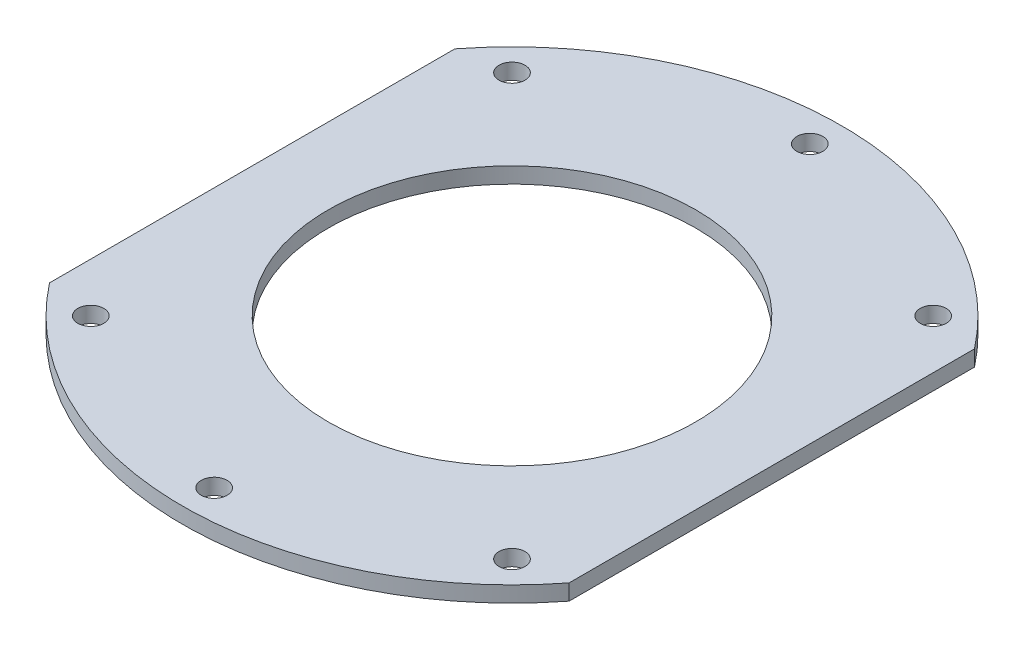
ISO-10303-21;
HEADER;
FILE_DESCRIPTION(('STEP AP214'),'2;1');
FILE_NAME('part.step','',(''),(''),'','','');
FILE_SCHEMA(('AUTOMOTIVE_DESIGN { 1 0 10303 214 1 1 1 1 }'));
ENDSEC;
DATA;
#1=APPLICATION_CONTEXT('core data for automotive mechanical design processes');
#2=APPLICATION_PROTOCOL_DEFINITION('international standard','automotive_design',2000,#1);
#3=PRODUCT_CONTEXT('',#1,'mechanical');
#4=PRODUCT('Part','Part','',(#3));
#5=PRODUCT_RELATED_PRODUCT_CATEGORY('part','',(#4));
#6=PRODUCT_DEFINITION_FORMATION('','',#4);
#7=PRODUCT_DEFINITION_CONTEXT('part definition',#1,'design');
#8=PRODUCT_DEFINITION('design','',#6,#7);
#9=PRODUCT_DEFINITION_SHAPE('','',#8);
#10=(LENGTH_UNIT() NAMED_UNIT(*) SI_UNIT(.MILLI.,.METRE.));
#11=(NAMED_UNIT(*) PLANE_ANGLE_UNIT() SI_UNIT($,.RADIAN.));
#12=(NAMED_UNIT(*) SI_UNIT($,.STERADIAN.) SOLID_ANGLE_UNIT());
#13=UNCERTAINTY_MEASURE_WITH_UNIT(LENGTH_MEASURE(1.E-05),#10,'distance_accuracy_value','');
#14=(GEOMETRIC_REPRESENTATION_CONTEXT(3) GLOBAL_UNCERTAINTY_ASSIGNED_CONTEXT((#13)) GLOBAL_UNIT_ASSIGNED_CONTEXT((#10,
#11,#12)) REPRESENTATION_CONTEXT('',''));
#15=CARTESIAN_POINT('',(0.,0.,0.));
#16=DIRECTION('',(0.,0.,1.));
#17=DIRECTION('',(1.,0.,0.));
#18=AXIS2_PLACEMENT_3D('',#15,#16,#17);
#19=CARTESIAN_POINT('',(0.,2.5,0.));
#20=DIRECTION('',(0.,1.,0.));
#21=DIRECTION('',(0.,0.,1.));
#22=AXIS2_PLACEMENT_3D('',#19,#20,#21);
#23=PLANE('',#22);
#24=CARTESIAN_POINT('',(0.,2.5,-47.));
#25=DIRECTION('',(0.,1.,0.));
#26=DIRECTION('',(0.,0.,1.));
#27=AXIS2_PLACEMENT_3D('',#24,#25,#26);
#28=CIRCLE('',#27,2.05);
#29=CARTESIAN_POINT('',(0.,2.5,-44.95));
#30=VERTEX_POINT('',#29);
#31=EDGE_CURVE('E268',#30,#30,#28,.T.);
#32=ORIENTED_EDGE('',*,*,#31,.F.);
#33=EDGE_LOOP('',(#32));
#34=FACE_BOUND('',#33,.T.);
#35=CARTESIAN_POINT('',(0.,2.5,47.));
#36=DIRECTION('',(0.,1.,0.));
#37=DIRECTION('',(0.,0.,1.));
#38=AXIS2_PLACEMENT_3D('',#35,#36,#37);
#39=CIRCLE('',#38,2.05);
#40=CARTESIAN_POINT('',(0.,2.5,49.05));
#41=VERTEX_POINT('',#40);
#42=EDGE_CURVE('E286',#41,#41,#39,.T.);
#43=ORIENTED_EDGE('',*,*,#42,.F.);
#44=EDGE_LOOP('',(#43));
#45=FACE_BOUND('',#44,.T.);
#46=CARTESIAN_POINT('',(0.,2.5,0.));
#47=DIRECTION('',(0.,1.,0.));
#48=DIRECTION('',(0.,0.,1.));
#49=AXIS2_PLACEMENT_3D('',#46,#47,#48);
#50=CIRCLE('',#49,29.);
#51=CARTESIAN_POINT('',(0.,2.5,29.));
#52=VERTEX_POINT('',#51);
#53=EDGE_CURVE('E125',#52,#52,#50,.T.);
#54=ORIENTED_EDGE('',*,*,#53,.F.);
#55=EDGE_LOOP('',(#54));
#56=FACE_BOUND('',#55,.T.);
#57=CARTESIAN_POINT('',(33.2340187157677,2.5,33.2340187157677));
#58=DIRECTION('',(0.,1.,0.));
#59=DIRECTION('',(0.,0.,1.));
#60=AXIS2_PLACEMENT_3D('',#57,#58,#59);
#61=CIRCLE('',#60,2.05);
#62=CARTESIAN_POINT('',(33.2340187157677,2.5,35.2840187157677));
#63=VERTEX_POINT('',#62);
#64=EDGE_CURVE('E292',#63,#63,#61,.T.);
#65=ORIENTED_EDGE('',*,*,#64,.F.);
#66=EDGE_LOOP('',(#65));
#67=FACE_BOUND('',#66,.T.);
#68=CARTESIAN_POINT('',(-33.2340187157677,2.5,33.2340187157677));
#69=DIRECTION('',(0.,1.,0.));
#70=DIRECTION('',(0.,0.,1.));
#71=AXIS2_PLACEMENT_3D('',#68,#69,#70);
#72=CIRCLE('',#71,2.05);
#73=CARTESIAN_POINT('',(-33.2340187157677,2.5,35.2840187157677));
#74=VERTEX_POINT('',#73);
#75=EDGE_CURVE('E280',#74,#74,#72,.T.);
#76=ORIENTED_EDGE('',*,*,#75,.F.);
#77=EDGE_LOOP('',(#76));
#78=FACE_BOUND('',#77,.T.);
#79=CARTESIAN_POINT('',(-33.2340187157677,2.5,-33.2340187157677));
#80=DIRECTION('',(0.,1.,0.));
#81=DIRECTION('',(0.,0.,1.));
#82=AXIS2_PLACEMENT_3D('',#79,#80,#81);
#83=CIRCLE('',#82,2.05);
#84=CARTESIAN_POINT('',(-33.2340187157677,2.5,-31.1840187157677));
#85=VERTEX_POINT('',#84);
#86=EDGE_CURVE('E274',#85,#85,#83,.T.);
#87=ORIENTED_EDGE('',*,*,#86,.F.);
#88=EDGE_LOOP('',(#87));
#89=FACE_BOUND('',#88,.T.);
#90=CARTESIAN_POINT('',(33.2340187157677,2.5,-33.2340187157677));
#91=DIRECTION('',(0.,1.,0.));
#92=DIRECTION('',(0.,0.,1.));
#93=AXIS2_PLACEMENT_3D('',#90,#91,#92);
#94=CIRCLE('',#93,2.05);
#95=CARTESIAN_POINT('',(33.2340187157677,2.5,-31.1840187157677));
#96=VERTEX_POINT('',#95);
#97=EDGE_CURVE('E258',#96,#96,#94,.T.);
#98=ORIENTED_EDGE('',*,*,#97,.F.);
#99=EDGE_LOOP('',(#98));
#100=FACE_BOUND('',#99,.T.);
#101=CARTESIAN_POINT('',(0.,2.5,0.));
#102=DIRECTION('',(0.,1.,0.));
#103=DIRECTION('',(0.,0.,1.));
#104=AXIS2_PLACEMENT_3D('',#101,#102,#103);
#105=CIRCLE('',#104,52.);
#106=CARTESIAN_POINT('',(-41.,2.5,31.984371183439));
#107=VERTEX_POINT('',#106);
#108=CARTESIAN_POINT('',(41.,2.5,31.984371183439));
#109=VERTEX_POINT('',#108);
#110=EDGE_CURVE('E111',#107,#109,#105,.T.);
#111=ORIENTED_EDGE('',*,*,#110,.T.);
#112=DIRECTION('',(0.,0.,-1.));
#113=VECTOR('',#112,1.);
#114=CARTESIAN_POINT('',(41.,2.5,55.0176136765046));
#115=LINE('',#114,#113);
#116=CARTESIAN_POINT('',(41.,2.5,-31.984371183439));
#117=VERTEX_POINT('',#116);
#118=EDGE_CURVE('E99',#109,#117,#115,.T.);
#119=ORIENTED_EDGE('',*,*,#118,.T.);
#120=CARTESIAN_POINT('',(-41.,2.5,-31.984371183439));
#121=VERTEX_POINT('',#120);
#122=EDGE_CURVE('E115',#117,#121,#105,.T.);
#123=ORIENTED_EDGE('',*,*,#122,.T.);
#124=DIRECTION('',(0.,0.,1.));
#125=VECTOR('',#124,1.);
#126=CARTESIAN_POINT('',(-41.,2.5,55.0176136765046));
#127=LINE('',#126,#125);
#128=EDGE_CURVE('E106',#121,#107,#127,.T.);
#129=ORIENTED_EDGE('',*,*,#128,.T.);
#130=EDGE_LOOP('',(#111,#119,#123,#129));
#131=FACE_BOUND('',#130,.T.);
#132=ADVANCED_FACE('F61',(#34,#45,#56,#67,#78,#89,#100,#131),#23,.T.);
#133=CARTESIAN_POINT('',(0.,0.,0.));
#134=DIRECTION('',(0.,1.,0.));
#135=DIRECTION('',(0.,0.,1.));
#136=AXIS2_PLACEMENT_3D('',#133,#134,#135);
#137=PLANE('',#136);
#138=CARTESIAN_POINT('',(0.,0.,0.));
#139=DIRECTION('',(0.,1.,0.));
#140=DIRECTION('',(0.,0.,1.));
#141=AXIS2_PLACEMENT_3D('',#138,#139,#140);
#142=CIRCLE('',#141,29.);
#143=CARTESIAN_POINT('',(0.,0.,29.));
#144=VERTEX_POINT('',#143);
#145=EDGE_CURVE('E122',#144,#144,#142,.T.);
#146=ORIENTED_EDGE('',*,*,#145,.T.);
#147=EDGE_LOOP('',(#146));
#148=FACE_BOUND('',#147,.T.);
#149=CARTESIAN_POINT('',(33.2340187157677,0.,33.2340187157677));
#150=DIRECTION('',(0.,1.,0.));
#151=DIRECTION('',(0.,0.,1.));
#152=AXIS2_PLACEMENT_3D('',#149,#150,#151);
#153=CIRCLE('',#152,2.05);
#154=CARTESIAN_POINT('',(33.2340187157677,0.,35.2840187157677));
#155=VERTEX_POINT('',#154);
#156=EDGE_CURVE('E289',#155,#155,#153,.T.);
#157=ORIENTED_EDGE('',*,*,#156,.T.);
#158=EDGE_LOOP('',(#157));
#159=FACE_BOUND('',#158,.T.);
#160=CARTESIAN_POINT('',(0.,0.,47.));
#161=DIRECTION('',(0.,1.,0.));
#162=DIRECTION('',(0.,0.,1.));
#163=AXIS2_PLACEMENT_3D('',#160,#161,#162);
#164=CIRCLE('',#163,2.05);
#165=CARTESIAN_POINT('',(0.,0.,49.05));
#166=VERTEX_POINT('',#165);
#167=EDGE_CURVE('E283',#166,#166,#164,.T.);
#168=ORIENTED_EDGE('',*,*,#167,.T.);
#169=EDGE_LOOP('',(#168));
#170=FACE_BOUND('',#169,.T.);
#171=CARTESIAN_POINT('',(-33.2340187157677,0.,33.2340187157677));
#172=DIRECTION('',(0.,1.,0.));
#173=DIRECTION('',(0.,0.,1.));
#174=AXIS2_PLACEMENT_3D('',#171,#172,#173);
#175=CIRCLE('',#174,2.05);
#176=CARTESIAN_POINT('',(-33.2340187157677,0.,35.2840187157677));
#177=VERTEX_POINT('',#176);
#178=EDGE_CURVE('E277',#177,#177,#175,.T.);
#179=ORIENTED_EDGE('',*,*,#178,.T.);
#180=EDGE_LOOP('',(#179));
#181=FACE_BOUND('',#180,.T.);
#182=CARTESIAN_POINT('',(-33.2340187157677,0.,-33.2340187157677));
#183=DIRECTION('',(0.,1.,0.));
#184=DIRECTION('',(0.,0.,1.));
#185=AXIS2_PLACEMENT_3D('',#182,#183,#184);
#186=CIRCLE('',#185,2.05);
#187=CARTESIAN_POINT('',(-33.2340187157677,0.,-31.1840187157677));
#188=VERTEX_POINT('',#187);
#189=EDGE_CURVE('E271',#188,#188,#186,.T.);
#190=ORIENTED_EDGE('',*,*,#189,.T.);
#191=EDGE_LOOP('',(#190));
#192=FACE_BOUND('',#191,.T.);
#193=CARTESIAN_POINT('',(0.,0.,-47.));
#194=DIRECTION('',(0.,1.,0.));
#195=DIRECTION('',(0.,0.,1.));
#196=AXIS2_PLACEMENT_3D('',#193,#194,#195);
#197=CIRCLE('',#196,2.05);
#198=CARTESIAN_POINT('',(0.,0.,-44.95));
#199=VERTEX_POINT('',#198);
#200=EDGE_CURVE('E264',#199,#199,#197,.T.);
#201=ORIENTED_EDGE('',*,*,#200,.T.);
#202=EDGE_LOOP('',(#201));
#203=FACE_BOUND('',#202,.T.);
#204=CARTESIAN_POINT('',(33.2340187157677,0.,-33.2340187157677));
#205=DIRECTION('',(0.,1.,0.));
#206=DIRECTION('',(0.,0.,1.));
#207=AXIS2_PLACEMENT_3D('',#204,#205,#206);
#208=CIRCLE('',#207,2.05);
#209=CARTESIAN_POINT('',(33.2340187157677,0.,-31.1840187157677));
#210=VERTEX_POINT('',#209);
#211=EDGE_CURVE('E261',#210,#210,#208,.T.);
#212=ORIENTED_EDGE('',*,*,#211,.T.);
#213=EDGE_LOOP('',(#212));
#214=FACE_BOUND('',#213,.T.);
#215=DIRECTION('',(0.,0.,-1.));
#216=VECTOR('',#215,1.);
#217=CARTESIAN_POINT('',(41.,0.,0.));
#218=LINE('',#217,#216);
#219=CARTESIAN_POINT('',(41.,0.,31.984371183439));
#220=VERTEX_POINT('',#219);
#221=CARTESIAN_POINT('',(41.,0.,-31.984371183439));
#222=VERTEX_POINT('',#221);
#223=EDGE_CURVE('E83',#220,#222,#218,.T.);
#224=ORIENTED_EDGE('',*,*,#223,.F.);
#225=CARTESIAN_POINT('',(0.,0.,0.));
#226=DIRECTION('',(0.,1.,0.));
#227=DIRECTION('',(0.,0.,1.));
#228=AXIS2_PLACEMENT_3D('',#225,#226,#227);
#229=CIRCLE('',#228,52.);
#230=CARTESIAN_POINT('',(-41.,0.,31.984371183439));
#231=VERTEX_POINT('',#230);
#232=EDGE_CURVE('E113',#231,#220,#229,.T.);
#233=ORIENTED_EDGE('',*,*,#232,.F.);
#234=DIRECTION('',(0.,0.,1.));
#235=VECTOR('',#234,1.);
#236=CARTESIAN_POINT('',(-41.,0.,0.));
#237=LINE('',#236,#235);
#238=CARTESIAN_POINT('',(-41.,0.,-31.984371183439));
#239=VERTEX_POINT('',#238);
#240=EDGE_CURVE('E76',#239,#231,#237,.T.);
#241=ORIENTED_EDGE('',*,*,#240,.F.);
#242=EDGE_CURVE('E116',#222,#239,#229,.T.);
#243=ORIENTED_EDGE('',*,*,#242,.F.);
#244=EDGE_LOOP('',(#224,#233,#241,#243));
#245=FACE_BOUND('',#244,.T.);
#246=ADVANCED_FACE('F133',(#148,#159,#170,#181,#192,#203,#214,#245),#137,.F.);
#247=CARTESIAN_POINT('',(0.,2.5,0.));
#248=DIRECTION('',(0.,-1.,0.));
#249=DIRECTION('',(0.,0.,-1.));
#250=AXIS2_PLACEMENT_3D('',#247,#248,#249);
#251=CYLINDRICAL_SURFACE('',#250,52.);
#252=DIRECTION('',(0.,-1.,0.));
#253=VECTOR('',#252,1.);
#254=CARTESIAN_POINT('',(41.,2.5,31.984371183439));
#255=LINE('',#254,#253);
#256=EDGE_CURVE('E12',#109,#220,#255,.T.);
#257=ORIENTED_EDGE('',*,*,#256,.F.);
#258=ORIENTED_EDGE('',*,*,#110,.F.);
#259=DIRECTION('',(0.,-1.,0.));
#260=VECTOR('',#259,1.);
#261=CARTESIAN_POINT('',(-41.,2.5,31.984371183439));
#262=LINE('',#261,#260);
#263=EDGE_CURVE('E118',#231,#107,#262,.F.);
#264=ORIENTED_EDGE('',*,*,#263,.F.);
#265=ORIENTED_EDGE('',*,*,#232,.T.);
#266=EDGE_LOOP('',(#257,#258,#264,#265));
#267=FACE_BOUND('',#266,.T.);
#268=ADVANCED_FACE('F63',(#267),#251,.T.);
#269=DIRECTION('',(0.,-1.,0.));
#270=VECTOR('',#269,1.);
#271=CARTESIAN_POINT('',(41.,2.5,-31.984371183439));
#272=LINE('',#271,#270);
#273=EDGE_CURVE('E69',#222,#117,#272,.F.);
#274=ORIENTED_EDGE('',*,*,#273,.F.);
#275=ORIENTED_EDGE('',*,*,#242,.T.);
#276=DIRECTION('',(0.,-1.,0.));
#277=VECTOR('',#276,1.);
#278=CARTESIAN_POINT('',(-41.,2.5,-31.984371183439));
#279=LINE('',#278,#277);
#280=EDGE_CURVE('E127',#121,#239,#279,.T.);
#281=ORIENTED_EDGE('',*,*,#280,.F.);
#282=ORIENTED_EDGE('',*,*,#122,.F.);
#283=EDGE_LOOP('',(#274,#275,#281,#282));
#284=FACE_BOUND('',#283,.T.);
#285=ADVANCED_FACE('F135',(#284),#251,.T.);
#286=CARTESIAN_POINT('',(0.,2.5,0.));
#287=DIRECTION('',(0.,-1.,0.));
#288=DIRECTION('',(0.,0.,-1.));
#289=AXIS2_PLACEMENT_3D('',#286,#287,#288);
#290=CYLINDRICAL_SURFACE('',#289,29.);
#291=ORIENTED_EDGE('',*,*,#53,.T.);
#292=EDGE_LOOP('',(#291));
#293=FACE_BOUND('',#292,.T.);
#294=ORIENTED_EDGE('',*,*,#145,.F.);
#295=EDGE_LOOP('',(#294));
#296=FACE_BOUND('',#295,.T.);
#297=ADVANCED_FACE('F137',(#293,#296),#290,.F.);
#298=CARTESIAN_POINT('',(33.2340187157677,2.5,33.2340187157677));
#299=DIRECTION('',(0.,-1.,0.));
#300=DIRECTION('',(0.,0.,-1.));
#301=AXIS2_PLACEMENT_3D('',#298,#299,#300);
#302=CYLINDRICAL_SURFACE('',#301,2.05);
#303=ORIENTED_EDGE('',*,*,#64,.T.);
#304=EDGE_LOOP('',(#303));
#305=FACE_BOUND('',#304,.T.);
#306=ORIENTED_EDGE('',*,*,#156,.F.);
#307=EDGE_LOOP('',(#306));
#308=FACE_BOUND('',#307,.T.);
#309=ADVANCED_FACE('F142',(#305,#308),#302,.F.);
#310=CARTESIAN_POINT('',(0.,2.5,47.));
#311=DIRECTION('',(0.,-1.,0.));
#312=DIRECTION('',(0.,0.,-1.));
#313=AXIS2_PLACEMENT_3D('',#310,#311,#312);
#314=CYLINDRICAL_SURFACE('',#313,2.05);
#315=ORIENTED_EDGE('',*,*,#42,.T.);
#316=EDGE_LOOP('',(#315));
#317=FACE_BOUND('',#316,.T.);
#318=ORIENTED_EDGE('',*,*,#167,.F.);
#319=EDGE_LOOP('',(#318));
#320=FACE_BOUND('',#319,.T.);
#321=ADVANCED_FACE('F157',(#317,#320),#314,.F.);
#322=CARTESIAN_POINT('',(-33.2340187157677,2.5,33.2340187157677));
#323=DIRECTION('',(0.,-1.,0.));
#324=DIRECTION('',(0.,0.,-1.));
#325=AXIS2_PLACEMENT_3D('',#322,#323,#324);
#326=CYLINDRICAL_SURFACE('',#325,2.05);
#327=ORIENTED_EDGE('',*,*,#75,.T.);
#328=EDGE_LOOP('',(#327));
#329=FACE_BOUND('',#328,.T.);
#330=ORIENTED_EDGE('',*,*,#178,.F.);
#331=EDGE_LOOP('',(#330));
#332=FACE_BOUND('',#331,.T.);
#333=ADVANCED_FACE('F161',(#329,#332),#326,.F.);
#334=CARTESIAN_POINT('',(-33.2340187157677,2.5,-33.2340187157677));
#335=DIRECTION('',(0.,-1.,0.));
#336=DIRECTION('',(0.,0.,-1.));
#337=AXIS2_PLACEMENT_3D('',#334,#335,#336);
#338=CYLINDRICAL_SURFACE('',#337,2.05);
#339=ORIENTED_EDGE('',*,*,#86,.T.);
#340=EDGE_LOOP('',(#339));
#341=FACE_BOUND('',#340,.T.);
#342=ORIENTED_EDGE('',*,*,#189,.F.);
#343=EDGE_LOOP('',(#342));
#344=FACE_BOUND('',#343,.T.);
#345=ADVANCED_FACE('F165',(#341,#344),#338,.F.);
#346=CARTESIAN_POINT('',(0.,2.5,-47.));
#347=DIRECTION('',(0.,-1.,0.));
#348=DIRECTION('',(0.,0.,-1.));
#349=AXIS2_PLACEMENT_3D('',#346,#347,#348);
#350=CYLINDRICAL_SURFACE('',#349,2.05);
#351=ORIENTED_EDGE('',*,*,#31,.T.);
#352=EDGE_LOOP('',(#351));
#353=FACE_BOUND('',#352,.T.);
#354=ORIENTED_EDGE('',*,*,#200,.F.);
#355=EDGE_LOOP('',(#354));
#356=FACE_BOUND('',#355,.T.);
#357=ADVANCED_FACE('F169',(#353,#356),#350,.F.);
#358=CARTESIAN_POINT('',(33.2340187157677,2.5,-33.2340187157677));
#359=DIRECTION('',(0.,-1.,0.));
#360=DIRECTION('',(0.,0.,-1.));
#361=AXIS2_PLACEMENT_3D('',#358,#359,#360);
#362=CYLINDRICAL_SURFACE('',#361,2.05);
#363=ORIENTED_EDGE('',*,*,#97,.T.);
#364=EDGE_LOOP('',(#363));
#365=FACE_BOUND('',#364,.T.);
#366=ORIENTED_EDGE('',*,*,#211,.F.);
#367=EDGE_LOOP('',(#366));
#368=FACE_BOUND('',#367,.T.);
#369=ADVANCED_FACE('F173',(#365,#368),#362,.F.);
#370=CARTESIAN_POINT('',(-41.,-1.5,55.0176136765046));
#371=DIRECTION('',(-1.,0.,0.));
#372=DIRECTION('',(0.,0.,1.));
#373=AXIS2_PLACEMENT_3D('',#370,#371,#372);
#374=PLANE('',#373);
#375=ORIENTED_EDGE('',*,*,#280,.T.);
#376=ORIENTED_EDGE('',*,*,#240,.T.);
#377=ORIENTED_EDGE('',*,*,#263,.T.);
#378=ORIENTED_EDGE('',*,*,#128,.F.);
#379=EDGE_LOOP('',(#375,#376,#377,#378));
#380=FACE_BOUND('',#379,.T.);
#381=ADVANCED_FACE('F129',(#380),#374,.T.);
#382=CARTESIAN_POINT('',(41.,-1.5,55.0176136765046));
#383=DIRECTION('',(1.,0.,0.));
#384=DIRECTION('',(0.,0.,-1.));
#385=AXIS2_PLACEMENT_3D('',#382,#383,#384);
#386=PLANE('',#385);
#387=ORIENTED_EDGE('',*,*,#256,.T.);
#388=ORIENTED_EDGE('',*,*,#223,.T.);
#389=ORIENTED_EDGE('',*,*,#273,.T.);
#390=ORIENTED_EDGE('',*,*,#118,.F.);
#391=EDGE_LOOP('',(#387,#388,#389,#390));
#392=FACE_BOUND('',#391,.T.);
#393=ADVANCED_FACE('F101',(#392),#386,.T.);
#394=CLOSED_SHELL('',(#132,#246,#268,#285,#297,#309,#321,#333,#345,#357,#369,#381,#393));
#395=MANIFOLD_SOLID_BREP('B2',#394);
#396=ADVANCED_BREP_SHAPE_REPRESENTATION('',(#18,#395),#14);
#397=SHAPE_DEFINITION_REPRESENTATION(#9,#396);
ENDSEC;
END-ISO-10303-21;
